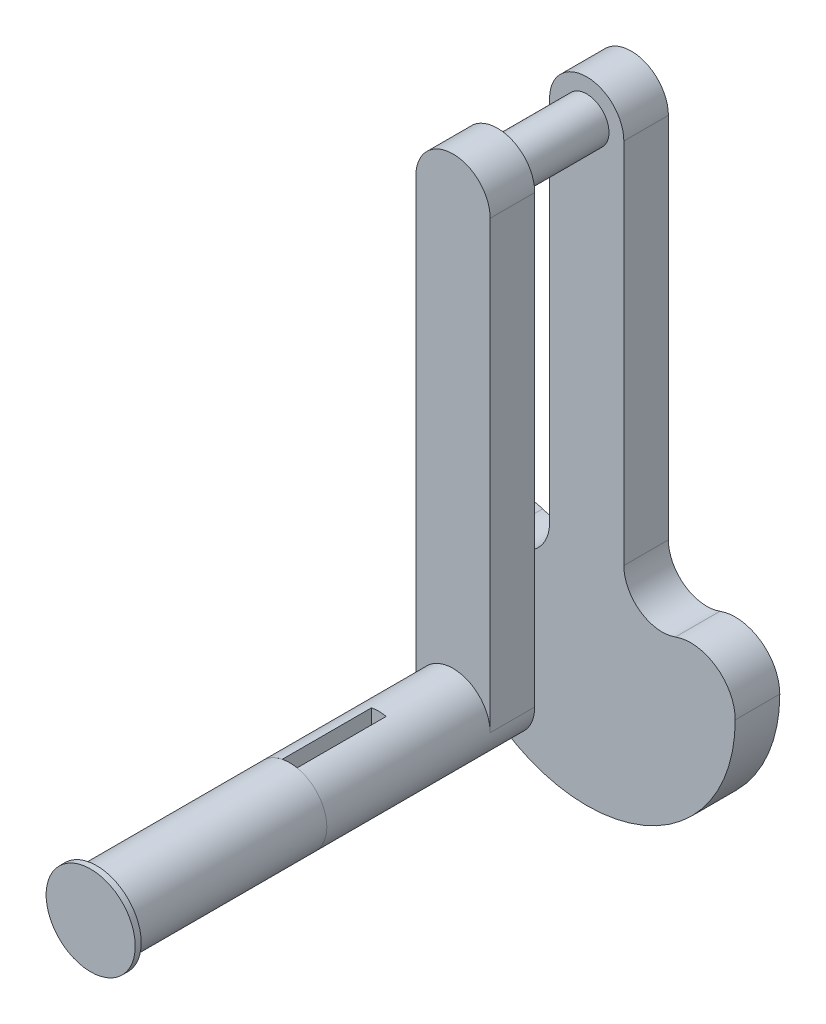
ISO-10303-21;
HEADER;
FILE_DESCRIPTION(('STEP AP214'),'2;1');
FILE_NAME('part.step','',(''),(''),'','','');
FILE_SCHEMA(('AUTOMOTIVE_DESIGN { 1 0 10303 214 1 1 1 1 }'));
ENDSEC;
DATA;
#1=APPLICATION_CONTEXT('core data for automotive mechanical design processes');
#2=APPLICATION_PROTOCOL_DEFINITION('international standard','automotive_design',2000,#1);
#3=PRODUCT_CONTEXT('',#1,'mechanical');
#4=PRODUCT('Part','Part','',(#3));
#5=PRODUCT_RELATED_PRODUCT_CATEGORY('part','',(#4));
#6=PRODUCT_DEFINITION_FORMATION('','',#4);
#7=PRODUCT_DEFINITION_CONTEXT('part definition',#1,'design');
#8=PRODUCT_DEFINITION('design','',#6,#7);
#9=PRODUCT_DEFINITION_SHAPE('','',#8);
#10=(LENGTH_UNIT() NAMED_UNIT(*) SI_UNIT(.MILLI.,.METRE.));
#11=(NAMED_UNIT(*) PLANE_ANGLE_UNIT() SI_UNIT($,.RADIAN.));
#12=(NAMED_UNIT(*) SI_UNIT($,.STERADIAN.) SOLID_ANGLE_UNIT());
#13=UNCERTAINTY_MEASURE_WITH_UNIT(LENGTH_MEASURE(1.E-05),#10,'distance_accuracy_value','');
#14=(GEOMETRIC_REPRESENTATION_CONTEXT(3) GLOBAL_UNCERTAINTY_ASSIGNED_CONTEXT((#13)) GLOBAL_UNIT_ASSIGNED_CONTEXT((#10,
#11,#12)) REPRESENTATION_CONTEXT('',''));
#15=CARTESIAN_POINT('',(0.,0.,0.));
#16=DIRECTION('',(0.,0.,1.));
#17=DIRECTION('',(1.,0.,0.));
#18=AXIS2_PLACEMENT_3D('',#15,#16,#17);
#19=CARTESIAN_POINT('',(0.,0.,97.));
#20=DIRECTION('',(0.,0.,-1.));
#21=DIRECTION('',(-1.,0.,0.));
#22=AXIS2_PLACEMENT_3D('',#19,#20,#21);
#23=CYLINDRICAL_SURFACE('',#22,15.);
#24=CARTESIAN_POINT('',(0.,0.,97.));
#25=DIRECTION('',(0.,0.,1.));
#26=DIRECTION('',(1.,0.,0.));
#27=AXIS2_PLACEMENT_3D('',#24,#25,#26);
#28=CIRCLE('',#27,15.);
#29=CARTESIAN_POINT('',(15.,0.,97.));
#30=VERTEX_POINT('',#29);
#31=EDGE_CURVE('E12',#30,#30,#28,.T.);
#32=ORIENTED_EDGE('',*,*,#31,.F.);
#33=EDGE_LOOP('',(#32));
#34=FACE_BOUND('',#33,.T.);
#35=CARTESIAN_POINT('',(0.,0.,95.));
#36=DIRECTION('',(0.,0.,1.));
#37=DIRECTION('',(1.,0.,0.));
#38=AXIS2_PLACEMENT_3D('',#35,#36,#37);
#39=CIRCLE('',#38,15.);
#40=CARTESIAN_POINT('',(15.,0.,95.));
#41=VERTEX_POINT('',#40);
#42=EDGE_CURVE('E58',#41,#41,#39,.T.);
#43=ORIENTED_EDGE('',*,*,#42,.T.);
#44=EDGE_LOOP('',(#43));
#45=FACE_BOUND('',#44,.T.);
#46=ADVANCED_FACE('F55',(#34,#45),#23,.T.);
#47=CARTESIAN_POINT('',(0.,0.,97.));
#48=DIRECTION('',(0.,0.,1.));
#49=DIRECTION('',(1.,0.,0.));
#50=AXIS2_PLACEMENT_3D('',#47,#48,#49);
#51=PLANE('',#50);
#52=ORIENTED_EDGE('',*,*,#31,.T.);
#53=EDGE_LOOP('',(#52));
#54=FACE_BOUND('',#53,.T.);
#55=ADVANCED_FACE('F70',(#54),#51,.T.);
#56=CARTESIAN_POINT('',(0.,0.,95.));
#57=DIRECTION('',(0.,0.,1.));
#58=DIRECTION('',(1.,0.,0.));
#59=AXIS2_PLACEMENT_3D('',#56,#57,#58);
#60=PLANE('',#59);
#61=ORIENTED_EDGE('',*,*,#42,.F.);
#62=EDGE_LOOP('',(#61));
#63=FACE_BOUND('',#62,.T.);
#64=ADVANCED_FACE('F68',(#63),#60,.F.);
#65=CLOSED_SHELL('',(#46,#55,#64));
#66=MANIFOLD_SOLID_BREP('B2',#65);
#67=CARTESIAN_POINT('',(0.,0.,95.));
#68=DIRECTION('',(0.,0.,-1.));
#69=DIRECTION('',(-1.,0.,0.));
#70=AXIS2_PLACEMENT_3D('',#67,#68,#69);
#71=CYLINDRICAL_SURFACE('',#70,12.5);
#72=CARTESIAN_POINT('',(0.,0.,95.));
#73=DIRECTION('',(0.,0.,1.));
#74=DIRECTION('',(1.,0.,0.));
#75=AXIS2_PLACEMENT_3D('',#72,#73,#74);
#76=CIRCLE('',#75,12.5);
#77=CARTESIAN_POINT('',(12.5,0.,95.));
#78=VERTEX_POINT('',#77);
#79=EDGE_CURVE('E54',#78,#78,#76,.T.);
#80=ORIENTED_EDGE('',*,*,#79,.F.);
#81=EDGE_LOOP('',(#80));
#82=FACE_BOUND('',#81,.T.);
#83=CARTESIAN_POINT('',(0.,0.,30.));
#84=DIRECTION('',(0.,0.,1.));
#85=DIRECTION('',(1.,0.,0.));
#86=AXIS2_PLACEMENT_3D('',#83,#84,#85);
#87=CIRCLE('',#86,12.5);
#88=CARTESIAN_POINT('',(12.5,0.,30.));
#89=VERTEX_POINT('',#88);
#90=EDGE_CURVE('E107',#89,#89,#87,.T.);
#91=ORIENTED_EDGE('',*,*,#90,.T.);
#92=EDGE_LOOP('',(#91));
#93=FACE_BOUND('',#92,.T.);
#94=ADVANCED_FACE('F104',(#82,#93),#71,.T.);
#95=CARTESIAN_POINT('',(0.,0.,95.));
#96=DIRECTION('',(0.,0.,1.));
#97=DIRECTION('',(1.,0.,0.));
#98=AXIS2_PLACEMENT_3D('',#95,#96,#97);
#99=PLANE('',#98);
#100=ORIENTED_EDGE('',*,*,#79,.T.);
#101=EDGE_LOOP('',(#100));
#102=FACE_BOUND('',#101,.T.);
#103=ADVANCED_FACE('F119',(#102),#99,.T.);
#104=CARTESIAN_POINT('',(0.,0.,30.));
#105=DIRECTION('',(0.,0.,1.));
#106=DIRECTION('',(1.,0.,0.));
#107=AXIS2_PLACEMENT_3D('',#104,#105,#106);
#108=PLANE('',#107);
#109=ORIENTED_EDGE('',*,*,#90,.F.);
#110=EDGE_LOOP('',(#109));
#111=FACE_BOUND('',#110,.T.);
#112=ADVANCED_FACE('F117',(#111),#108,.F.);
#113=CLOSED_SHELL('',(#94,#103,#112));
#114=MANIFOLD_SOLID_BREP('B7',#113);
#115=CARTESIAN_POINT('',(-2.5,0.,-25.));
#116=DIRECTION('',(-1.,0.,0.));
#117=DIRECTION('',(0.,-1.,0.));
#118=AXIS2_PLACEMENT_3D('',#115,#116,#117);
#119=PLANE('',#118);
#120=DIRECTION('',(0.,0.,1.));
#121=VECTOR('',#120,1.);
#122=CARTESIAN_POINT('',(-2.5,7.24744871391589,-25.));
#123=LINE('',#122,#121);
#124=CARTESIAN_POINT('',(-2.5,7.24744871391589,0.));
#125=VERTEX_POINT('',#124);
#126=CARTESIAN_POINT('',(-2.5,7.24744871391589,30.));
#127=VERTEX_POINT('',#126);
#128=EDGE_CURVE('E151',#125,#127,#123,.T.);
#129=ORIENTED_EDGE('',*,*,#128,.F.);
#130=DIRECTION('',(0.,1.,0.));
#131=VECTOR('',#130,1.);
#132=CARTESIAN_POINT('',(-2.5,0.,0.));
#133=LINE('',#132,#131);
#134=CARTESIAN_POINT('',(-2.5,12.2474487139159,0.));
#135=VERTEX_POINT('',#134);
#136=EDGE_CURVE('E380',#125,#135,#133,.T.);
#137=ORIENTED_EDGE('',*,*,#136,.T.);
#138=DIRECTION('',(0.,0.,1.));
#139=VECTOR('',#138,1.);
#140=CARTESIAN_POINT('',(-2.5,12.2474487139159,-25.));
#141=LINE('',#140,#139);
#142=CARTESIAN_POINT('',(-2.5,12.2474487139159,30.));
#143=VERTEX_POINT('',#142);
#144=EDGE_CURVE('E274',#135,#143,#141,.T.);
#145=ORIENTED_EDGE('',*,*,#144,.T.);
#146=DIRECTION('',(0.,-1.,0.));
#147=VECTOR('',#146,1.);
#148=CARTESIAN_POINT('',(-2.5,0.,30.));
#149=LINE('',#148,#147);
#150=EDGE_CURVE('E292',#143,#127,#149,.T.);
#151=ORIENTED_EDGE('',*,*,#150,.T.);
#152=EDGE_LOOP('',(#129,#137,#145,#151));
#153=FACE_BOUND('',#152,.T.);
#154=ADVANCED_FACE('F144',(#153),#119,.F.);
#155=CARTESIAN_POINT('',(0.,7.24744871391589,-25.));
#156=DIRECTION('',(0.,-1.,0.));
#157=DIRECTION('',(0.,0.,-1.));
#158=AXIS2_PLACEMENT_3D('',#155,#156,#157);
#159=PLANE('',#158);
#160=DIRECTION('',(0.,0.,1.));
#161=VECTOR('',#160,1.);
#162=CARTESIAN_POINT('',(2.5,7.24744871391589,-25.));
#163=LINE('',#162,#161);
#164=CARTESIAN_POINT('',(2.5,7.24744871391589,0.));
#165=VERTEX_POINT('',#164);
#166=CARTESIAN_POINT('',(2.5,7.24744871391589,30.));
#167=VERTEX_POINT('',#166);
#168=EDGE_CURVE('E281',#165,#167,#163,.T.);
#169=ORIENTED_EDGE('',*,*,#168,.F.);
#170=DIRECTION('',(-1.,0.,0.));
#171=VECTOR('',#170,1.);
#172=CARTESIAN_POINT('',(0.,7.24744871391589,0.));
#173=LINE('',#172,#171);
#174=EDGE_CURVE('E262',#165,#125,#173,.T.);
#175=ORIENTED_EDGE('',*,*,#174,.T.);
#176=ORIENTED_EDGE('',*,*,#128,.T.);
#177=DIRECTION('',(1.,0.,0.));
#178=VECTOR('',#177,1.);
#179=CARTESIAN_POINT('',(0.,7.24744871391589,30.));
#180=LINE('',#179,#178);
#181=EDGE_CURVE('E287',#127,#167,#180,.T.);
#182=ORIENTED_EDGE('',*,*,#181,.T.);
#183=EDGE_LOOP('',(#169,#175,#176,#182));
#184=FACE_BOUND('',#183,.T.);
#185=ADVANCED_FACE('F419',(#184),#159,.F.);
#186=CARTESIAN_POINT('',(2.5,0.,-25.));
#187=DIRECTION('',(1.,0.,0.));
#188=DIRECTION('',(0.,1.,0.));
#189=AXIS2_PLACEMENT_3D('',#186,#187,#188);
#190=PLANE('',#189);
#191=DIRECTION('',(0.,0.,1.));
#192=VECTOR('',#191,1.);
#193=CARTESIAN_POINT('',(2.5,12.2474487139159,-25.));
#194=LINE('',#193,#192);
#195=CARTESIAN_POINT('',(2.5,12.2474487139159,0.));
#196=VERTEX_POINT('',#195);
#197=CARTESIAN_POINT('',(2.5,12.2474487139159,30.));
#198=VERTEX_POINT('',#197);
#199=EDGE_CURVE('E272',#196,#198,#194,.T.);
#200=ORIENTED_EDGE('',*,*,#199,.F.);
#201=DIRECTION('',(0.,-1.,0.));
#202=VECTOR('',#201,1.);
#203=CARTESIAN_POINT('',(2.5,0.,0.));
#204=LINE('',#203,#202);
#205=EDGE_CURVE('E257',#196,#165,#204,.T.);
#206=ORIENTED_EDGE('',*,*,#205,.T.);
#207=ORIENTED_EDGE('',*,*,#168,.T.);
#208=DIRECTION('',(0.,1.,0.));
#209=VECTOR('',#208,1.);
#210=CARTESIAN_POINT('',(2.5,0.,30.));
#211=LINE('',#210,#209);
#212=EDGE_CURVE('E279',#167,#198,#211,.T.);
#213=ORIENTED_EDGE('',*,*,#212,.T.);
#214=EDGE_LOOP('',(#200,#206,#207,#213));
#215=FACE_BOUND('',#214,.T.);
#216=ADVANCED_FACE('F277',(#215),#190,.F.);
#217=CARTESIAN_POINT('',(0.,0.,-25.));
#218=DIRECTION('',(0.,0.,1.));
#219=DIRECTION('',(1.,0.,0.));
#220=AXIS2_PLACEMENT_3D('',#217,#218,#219);
#221=CYLINDRICAL_SURFACE('',#220,12.5);
#222=ORIENTED_EDGE('',*,*,#144,.F.);
#223=CARTESIAN_POINT('',(0.,0.,0.));
#224=DIRECTION('',(0.,0.,1.));
#225=DIRECTION('',(1.,0.,0.));
#226=AXIS2_PLACEMENT_3D('',#223,#224,#225);
#227=CIRCLE('',#226,12.5);
#228=EDGE_CURVE('E260',#196,#135,#227,.T.);
#229=ORIENTED_EDGE('',*,*,#228,.F.);
#230=ORIENTED_EDGE('',*,*,#199,.T.);
#231=CARTESIAN_POINT('',(0.,0.,30.));
#232=DIRECTION('',(0.,0.,1.));
#233=DIRECTION('',(1.,0.,0.));
#234=AXIS2_PLACEMENT_3D('',#231,#232,#233);
#235=CIRCLE('',#234,12.5);
#236=EDGE_CURVE('E290',#143,#198,#235,.T.);
#237=ORIENTED_EDGE('',*,*,#236,.F.);
#238=EDGE_LOOP('',(#222,#229,#230,#237));
#239=FACE_BOUND('',#238,.T.);
#240=DIRECTION('',(0.,0.,1.));
#241=VECTOR('',#240,1.);
#242=CARTESIAN_POINT('',(12.5,0.,-40.));
#243=LINE('',#242,#241);
#244=CARTESIAN_POINT('',(12.5,0.,-40.));
#245=VERTEX_POINT('',#244);
#246=CARTESIAN_POINT('',(12.5,0.,-25.));
#247=VERTEX_POINT('',#246);
#248=EDGE_CURVE('E305',#245,#247,#243,.T.);
#249=ORIENTED_EDGE('',*,*,#248,.T.);
#250=CARTESIAN_POINT('',(0.,0.,-25.));
#251=DIRECTION('',(0.,0.,1.));
#252=DIRECTION('',(1.,0.,0.));
#253=AXIS2_PLACEMENT_3D('',#250,#251,#252);
#254=CIRCLE('',#253,12.5);
#255=CARTESIAN_POINT('',(-12.5,0.,-25.));
#256=VERTEX_POINT('',#255);
#257=EDGE_CURVE('E284',#247,#256,#254,.T.);
#258=ORIENTED_EDGE('',*,*,#257,.T.);
#259=DIRECTION('',(0.,0.,1.));
#260=VECTOR('',#259,1.);
#261=CARTESIAN_POINT('',(-12.5,0.,-40.));
#262=LINE('',#261,#260);
#263=CARTESIAN_POINT('',(-12.5,0.,-40.));
#264=VERTEX_POINT('',#263);
#265=EDGE_CURVE('E295',#264,#256,#262,.T.);
#266=ORIENTED_EDGE('',*,*,#265,.F.);
#267=CARTESIAN_POINT('',(0.,0.,-40.));
#268=DIRECTION('',(0.,0.,-1.));
#269=DIRECTION('',(-1.,0.,0.));
#270=AXIS2_PLACEMENT_3D('',#267,#268,#269);
#271=CIRCLE('',#270,12.5);
#272=EDGE_CURVE('E311',#245,#264,#271,.T.);
#273=ORIENTED_EDGE('',*,*,#272,.F.);
#274=EDGE_LOOP('',(#249,#258,#266,#273));
#275=FACE_BOUND('',#274,.T.);
#276=ADVANCED_FACE('F269',(#239,#275),#221,.T.);
#277=CARTESIAN_POINT('',(0.,0.,30.));
#278=DIRECTION('',(0.,0.,1.));
#279=DIRECTION('',(1.,0.,0.));
#280=AXIS2_PLACEMENT_3D('',#277,#278,#279);
#281=PLANE('',#280);
#282=ORIENTED_EDGE('',*,*,#150,.F.);
#283=ORIENTED_EDGE('',*,*,#236,.T.);
#284=ORIENTED_EDGE('',*,*,#212,.F.);
#285=ORIENTED_EDGE('',*,*,#181,.F.);
#286=EDGE_LOOP('',(#282,#283,#284,#285));
#287=FACE_BOUND('',#286,.T.);
#288=ADVANCED_FACE('F427',(#287),#281,.T.);
#289=CARTESIAN_POINT('',(-12.5,0.,-40.));
#290=DIRECTION('',(1.,0.,0.));
#291=DIRECTION('',(0.,0.,-1.));
#292=AXIS2_PLACEMENT_3D('',#289,#290,#291);
#293=PLANE('',#292);
#294=DIRECTION('',(0.,1.,0.));
#295=VECTOR('',#294,1.);
#296=CARTESIAN_POINT('',(-12.5,0.,-25.));
#297=LINE('',#296,#295);
#298=CARTESIAN_POINT('',(-12.5,150.,-25.));
#299=VERTEX_POINT('',#298);
#300=EDGE_CURVE('E314',#256,#299,#297,.T.);
#301=ORIENTED_EDGE('',*,*,#300,.T.);
#302=DIRECTION('',(0.,0.,1.));
#303=VECTOR('',#302,1.);
#304=CARTESIAN_POINT('',(-12.5,150.,-40.));
#305=LINE('',#304,#303);
#306=CARTESIAN_POINT('',(-12.5,150.,-40.));
#307=VERTEX_POINT('',#306);
#308=EDGE_CURVE('E299',#307,#299,#305,.T.);
#309=ORIENTED_EDGE('',*,*,#308,.F.);
#310=DIRECTION('',(0.,1.,0.));
#311=VECTOR('',#310,1.);
#312=CARTESIAN_POINT('',(-12.5,0.,-40.));
#313=LINE('',#312,#311);
#314=EDGE_CURVE('E320',#264,#307,#313,.T.);
#315=ORIENTED_EDGE('',*,*,#314,.F.);
#316=ORIENTED_EDGE('',*,*,#265,.T.);
#317=EDGE_LOOP('',(#301,#309,#315,#316));
#318=FACE_BOUND('',#317,.T.);
#319=ADVANCED_FACE('F429',(#318),#293,.F.);
#320=CARTESIAN_POINT('',(0.,150.,-40.));
#321=DIRECTION('',(0.,0.,1.));
#322=DIRECTION('',(1.,0.,0.));
#323=AXIS2_PLACEMENT_3D('',#320,#321,#322);
#324=CYLINDRICAL_SURFACE('',#323,12.5);
#325=CARTESIAN_POINT('',(0.,150.,-25.));
#326=DIRECTION('',(0.,0.,-1.));
#327=DIRECTION('',(1.,0.,0.));
#328=AXIS2_PLACEMENT_3D('',#325,#326,#327);
#329=CIRCLE('',#328,12.5);
#330=CARTESIAN_POINT('',(12.5,150.,-25.));
#331=VERTEX_POINT('',#330);
#332=EDGE_CURVE('E312',#299,#331,#329,.T.);
#333=ORIENTED_EDGE('',*,*,#332,.T.);
#334=DIRECTION('',(0.,0.,1.));
#335=VECTOR('',#334,1.);
#336=CARTESIAN_POINT('',(12.5,150.,-40.));
#337=LINE('',#336,#335);
#338=CARTESIAN_POINT('',(12.5,150.,-40.));
#339=VERTEX_POINT('',#338);
#340=EDGE_CURVE('E302',#339,#331,#337,.T.);
#341=ORIENTED_EDGE('',*,*,#340,.F.);
#342=CARTESIAN_POINT('',(0.,150.,-40.));
#343=DIRECTION('',(0.,0.,-1.));
#344=DIRECTION('',(1.,0.,0.));
#345=AXIS2_PLACEMENT_3D('',#342,#343,#344);
#346=CIRCLE('',#345,12.5);
#347=EDGE_CURVE('E318',#307,#339,#346,.T.);
#348=ORIENTED_EDGE('',*,*,#347,.F.);
#349=ORIENTED_EDGE('',*,*,#308,.T.);
#350=EDGE_LOOP('',(#333,#341,#348,#349));
#351=FACE_BOUND('',#350,.T.);
#352=ADVANCED_FACE('F435',(#351),#324,.T.);
#353=CARTESIAN_POINT('',(12.5,0.,-40.));
#354=DIRECTION('',(-1.,0.,0.));
#355=DIRECTION('',(0.,0.,1.));
#356=AXIS2_PLACEMENT_3D('',#353,#354,#355);
#357=PLANE('',#356);
#358=DIRECTION('',(0.,-1.,0.));
#359=VECTOR('',#358,1.);
#360=CARTESIAN_POINT('',(12.5,0.,-25.));
#361=LINE('',#360,#359);
#362=EDGE_CURVE('E308',#331,#247,#361,.T.);
#363=ORIENTED_EDGE('',*,*,#362,.T.);
#364=ORIENTED_EDGE('',*,*,#248,.F.);
#365=DIRECTION('',(0.,-1.,0.));
#366=VECTOR('',#365,1.);
#367=CARTESIAN_POINT('',(12.5,0.,-40.));
#368=LINE('',#367,#366);
#369=EDGE_CURVE('E307',#339,#245,#368,.T.);
#370=ORIENTED_EDGE('',*,*,#369,.F.);
#371=ORIENTED_EDGE('',*,*,#340,.T.);
#372=EDGE_LOOP('',(#363,#364,#370,#371));
#373=FACE_BOUND('',#372,.T.);
#374=ADVANCED_FACE('F465',(#373),#357,.F.);
#375=CARTESIAN_POINT('',(0.,0.,-40.));
#376=DIRECTION('',(0.,0.,-1.));
#377=DIRECTION('',(-1.,0.,0.));
#378=AXIS2_PLACEMENT_3D('',#375,#376,#377);
#379=PLANE('',#378);
#380=CARTESIAN_POINT('',(0.,150.,-40.));
#381=DIRECTION('',(0.,0.,-1.));
#382=DIRECTION('',(-1.,0.,0.));
#383=AXIS2_PLACEMENT_3D('',#380,#381,#382);
#384=CIRCLE('',#383,7.5);
#385=CARTESIAN_POINT('',(-7.5,150.,-40.));
#386=VERTEX_POINT('',#385);
#387=EDGE_CURVE('E324',#386,#386,#384,.T.);
#388=ORIENTED_EDGE('',*,*,#387,.F.);
#389=EDGE_LOOP('',(#388));
#390=FACE_BOUND('',#389,.T.);
#391=ORIENTED_EDGE('',*,*,#272,.T.);
#392=ORIENTED_EDGE('',*,*,#314,.T.);
#393=ORIENTED_EDGE('',*,*,#347,.T.);
#394=ORIENTED_EDGE('',*,*,#369,.T.);
#395=EDGE_LOOP('',(#391,#392,#393,#394));
#396=FACE_BOUND('',#395,.T.);
#397=ADVANCED_FACE('F470',(#390,#396),#379,.T.);
#398=CARTESIAN_POINT('',(0.,0.,-25.));
#399=DIRECTION('',(0.,0.,-1.));
#400=DIRECTION('',(-1.,0.,0.));
#401=AXIS2_PLACEMENT_3D('',#398,#399,#400);
#402=PLANE('',#401);
#403=ORIENTED_EDGE('',*,*,#257,.F.);
#404=ORIENTED_EDGE('',*,*,#362,.F.);
#405=ORIENTED_EDGE('',*,*,#332,.F.);
#406=ORIENTED_EDGE('',*,*,#300,.F.);
#407=EDGE_LOOP('',(#403,#404,#405,#406));
#408=FACE_BOUND('',#407,.T.);
#409=ADVANCED_FACE('F478',(#408),#402,.F.);
#410=CARTESIAN_POINT('',(0.,150.,-70.));
#411=DIRECTION('',(0.,0.,1.));
#412=DIRECTION('',(1.,0.,0.));
#413=AXIS2_PLACEMENT_3D('',#410,#411,#412);
#414=CYLINDRICAL_SURFACE('',#413,7.5);
#415=CARTESIAN_POINT('',(0.,150.,-70.));
#416=DIRECTION('',(0.,0.,-1.));
#417=DIRECTION('',(-1.,0.,0.));
#418=AXIS2_PLACEMENT_3D('',#415,#416,#417);
#419=CIRCLE('',#418,7.5);
#420=CARTESIAN_POINT('',(-7.5,150.,-70.));
#421=VERTEX_POINT('',#420);
#422=EDGE_CURVE('E316',#421,#421,#419,.T.);
#423=ORIENTED_EDGE('',*,*,#422,.F.);
#424=EDGE_LOOP('',(#423));
#425=FACE_BOUND('',#424,.T.);
#426=ORIENTED_EDGE('',*,*,#387,.T.);
#427=EDGE_LOOP('',(#426));
#428=FACE_BOUND('',#427,.T.);
#429=ADVANCED_FACE('F483',(#425,#428),#414,.T.);
#430=CARTESIAN_POINT('',(0.,150.,-85.));
#431=DIRECTION('',(0.,0.,1.));
#432=DIRECTION('',(1.,0.,0.));
#433=AXIS2_PLACEMENT_3D('',#430,#431,#432);
#434=CYLINDRICAL_SURFACE('',#433,12.5);
#435=CARTESIAN_POINT('',(0.,150.,-70.));
#436=DIRECTION('',(0.,0.,-1.));
#437=DIRECTION('',(1.,0.,0.));
#438=AXIS2_PLACEMENT_3D('',#435,#436,#437);
#439=CIRCLE('',#438,12.5);
#440=CARTESIAN_POINT('',(-12.5,150.,-70.));
#441=VERTEX_POINT('',#440);
#442=CARTESIAN_POINT('',(12.5,150.,-70.));
#443=VERTEX_POINT('',#442);
#444=EDGE_CURVE('E342',#441,#443,#439,.T.);
#445=ORIENTED_EDGE('',*,*,#444,.T.);
#446=DIRECTION('',(0.,0.,1.));
#447=VECTOR('',#446,1.);
#448=CARTESIAN_POINT('',(12.5,150.,-85.));
#449=LINE('',#448,#447);
#450=CARTESIAN_POINT('',(12.5,150.,-85.));
#451=VERTEX_POINT('',#450);
#452=EDGE_CURVE('E327',#451,#443,#449,.T.);
#453=ORIENTED_EDGE('',*,*,#452,.F.);
#454=CARTESIAN_POINT('',(0.,150.,-85.));
#455=DIRECTION('',(0.,0.,-1.));
#456=DIRECTION('',(1.,0.,0.));
#457=AXIS2_PLACEMENT_3D('',#454,#455,#456);
#458=CIRCLE('',#457,12.5);
#459=CARTESIAN_POINT('',(-12.5,150.,-85.));
#460=VERTEX_POINT('',#459);
#461=EDGE_CURVE('E338',#460,#451,#458,.T.);
#462=ORIENTED_EDGE('',*,*,#461,.F.);
#463=DIRECTION('',(0.,0.,1.));
#464=VECTOR('',#463,1.);
#465=CARTESIAN_POINT('',(-12.5,150.,-85.));
#466=LINE('',#465,#464);
#467=EDGE_CURVE('E332',#460,#441,#466,.T.);
#468=ORIENTED_EDGE('',*,*,#467,.T.);
#469=EDGE_LOOP('',(#445,#453,#462,#468));
#470=FACE_BOUND('',#469,.T.);
#471=ADVANCED_FACE('F570',(#470),#434,.T.);
#472=CARTESIAN_POINT('',(12.5,150.,-85.));
#473=DIRECTION('',(-1.,0.,0.));
#474=DIRECTION('',(0.,0.,1.));
#475=AXIS2_PLACEMENT_3D('',#472,#473,#474);
#476=PLANE('',#475);
#477=DIRECTION('',(0.,-1.,0.));
#478=VECTOR('',#477,1.);
#479=CARTESIAN_POINT('',(12.5,150.,-70.));
#480=LINE('',#479,#478);
#481=CARTESIAN_POINT('',(12.5,26.2396049751373,-70.));
#482=VERTEX_POINT('',#481);
#483=EDGE_CURVE('E339',#443,#482,#480,.T.);
#484=ORIENTED_EDGE('',*,*,#483,.T.);
#485=DIRECTION('',(0.,0.,1.));
#486=VECTOR('',#485,1.);
#487=CARTESIAN_POINT('',(12.5,26.2396049751373,-218.696363043814));
#488=LINE('',#487,#486);
#489=CARTESIAN_POINT('',(12.5,26.2396049751373,-85.));
#490=VERTEX_POINT('',#489);
#491=EDGE_CURVE('E362',#490,#482,#488,.T.);
#492=ORIENTED_EDGE('',*,*,#491,.F.);
#493=DIRECTION('',(0.,-1.,0.));
#494=VECTOR('',#493,1.);
#495=CARTESIAN_POINT('',(12.5,150.,-85.));
#496=LINE('',#495,#494);
#497=EDGE_CURVE('E347',#451,#490,#496,.T.);
#498=ORIENTED_EDGE('',*,*,#497,.F.);
#499=ORIENTED_EDGE('',*,*,#452,.T.);
#500=EDGE_LOOP('',(#484,#492,#498,#499));
#501=FACE_BOUND('',#500,.T.);
#502=ADVANCED_FACE('F566',(#501),#476,.F.);
#503=CARTESIAN_POINT('',(-12.5,150.,-85.));
#504=DIRECTION('',(1.,0.,0.));
#505=DIRECTION('',(0.,1.,0.));
#506=AXIS2_PLACEMENT_3D('',#503,#504,#505);
#507=PLANE('',#506);
#508=DIRECTION('',(0.,1.,0.));
#509=VECTOR('',#508,1.);
#510=CARTESIAN_POINT('',(-12.5,150.,-85.));
#511=LINE('',#510,#509);
#512=CARTESIAN_POINT('',(-12.5,26.2396049751373,-85.));
#513=VERTEX_POINT('',#512);
#514=EDGE_CURVE('E335',#513,#460,#511,.T.);
#515=ORIENTED_EDGE('',*,*,#514,.F.);
#516=DIRECTION('',(0.,0.,1.));
#517=VECTOR('',#516,1.);
#518=CARTESIAN_POINT('',(-12.5,26.2396049751373,-218.696363043814));
#519=LINE('',#518,#517);
#520=CARTESIAN_POINT('',(-12.5,26.2396049751373,-70.));
#521=VERTEX_POINT('',#520);
#522=EDGE_CURVE('E158',#513,#521,#519,.T.);
#523=ORIENTED_EDGE('',*,*,#522,.T.);
#524=DIRECTION('',(0.,1.,0.));
#525=VECTOR('',#524,1.);
#526=CARTESIAN_POINT('',(-12.5,150.,-70.));
#527=LINE('',#526,#525);
#528=EDGE_CURVE('E336',#521,#441,#527,.T.);
#529=ORIENTED_EDGE('',*,*,#528,.T.);
#530=ORIENTED_EDGE('',*,*,#467,.F.);
#531=EDGE_LOOP('',(#515,#523,#529,#530));
#532=FACE_BOUND('',#531,.T.);
#533=ADVANCED_FACE('F510',(#532),#507,.F.);
#534=CARTESIAN_POINT('',(0.,150.,-85.));
#535=DIRECTION('',(0.,0.,1.));
#536=DIRECTION('',(1.,0.,0.));
#537=AXIS2_PLACEMENT_3D('',#534,#535,#536);
#538=PLANE('',#537);
#539=CARTESIAN_POINT('',(-33.8074039201174,-9.05866657858836,-85.));
#540=DIRECTION('',(0.,0.,1.));
#541=DIRECTION('',(1.,0.,0.));
#542=AXIS2_PLACEMENT_3D('',#539,#540,#541);
#543=CIRCLE('',#542,5.);
#544=CARTESIAN_POINT('',(-28.8074039201174,-9.05866657858836,-85.));
#545=VERTEX_POINT('',#544);
#546=EDGE_CURVE('E102',#545,#545,#543,.F.);
#547=ORIENTED_EDGE('',*,*,#546,.F.);
#548=EDGE_LOOP('',(#547));
#549=FACE_BOUND('',#548,.T.);
#550=ORIENTED_EDGE('',*,*,#497,.T.);
#551=CARTESIAN_POINT('',(25.43022492335,26.2396049751373,-85.));
#552=DIRECTION('',(0.,0.,1.));
#553=DIRECTION('',(1.,0.,0.));
#554=AXIS2_PLACEMENT_3D('',#551,#552,#553);
#555=CIRCLE('',#554,12.93022492335);
#556=CARTESIAN_POINT('',(29.8605273840905,14.0920481559749,-85.));
#557=VERTEX_POINT('',#556);
#558=EDGE_CURVE('E352',#557,#490,#555,.F.);
#559=ORIENTED_EDGE('',*,*,#558,.F.);
#560=CARTESIAN_POINT('',(35.,0.,-85.));
#561=DIRECTION('',(0.,0.,1.));
#562=DIRECTION('',(1.,0.,0.));
#563=AXIS2_PLACEMENT_3D('',#560,#561,#562);
#564=CIRCLE('',#563,15.);
#565=CARTESIAN_POINT('',(50.,0.,-85.));
#566=VERTEX_POINT('',#565);
#567=EDGE_CURVE('E345',#566,#557,#564,.T.);
#568=ORIENTED_EDGE('',*,*,#567,.F.);
#569=CARTESIAN_POINT('',(0.,0.,-85.));
#570=DIRECTION('',(0.,0.,1.));
#571=DIRECTION('',(1.,0.,0.));
#572=AXIS2_PLACEMENT_3D('',#569,#570,#571);
#573=CIRCLE('',#572,50.);
#574=CARTESIAN_POINT('',(-50.,0.,-85.));
#575=VERTEX_POINT('',#574);
#576=EDGE_CURVE('E383',#575,#566,#573,.T.);
#577=ORIENTED_EDGE('',*,*,#576,.F.);
#578=CARTESIAN_POINT('',(-35.,0.,-85.));
#579=DIRECTION('',(0.,0.,1.));
#580=DIRECTION('',(1.,0.,0.));
#581=AXIS2_PLACEMENT_3D('',#578,#579,#580);
#582=CIRCLE('',#581,15.);
#583=CARTESIAN_POINT('',(-29.8605273840905,14.0920481559749,-85.));
#584=VERTEX_POINT('',#583);
#585=EDGE_CURVE('E386',#584,#575,#582,.T.);
#586=ORIENTED_EDGE('',*,*,#585,.F.);
#587=CARTESIAN_POINT('',(-25.43022492335,26.2396049751373,-85.));
#588=DIRECTION('',(0.,0.,1.));
#589=DIRECTION('',(1.,0.,0.));
#590=AXIS2_PLACEMENT_3D('',#587,#588,#589);
#591=CIRCLE('',#590,12.93022492335);
#592=EDGE_CURVE('E354',#513,#584,#591,.F.);
#593=ORIENTED_EDGE('',*,*,#592,.F.);
#594=ORIENTED_EDGE('',*,*,#514,.T.);
#595=ORIENTED_EDGE('',*,*,#461,.T.);
#596=EDGE_LOOP('',(#550,#559,#568,#577,#586,#593,#594,#595));
#597=FACE_BOUND('',#596,.T.);
#598=ADVANCED_FACE('F504',(#549,#597),#538,.F.);
#599=CARTESIAN_POINT('',(0.,150.,-70.));
#600=DIRECTION('',(0.,0.,1.));
#601=DIRECTION('',(1.,0.,0.));
#602=AXIS2_PLACEMENT_3D('',#599,#600,#601);
#603=PLANE('',#602);
#604=CARTESIAN_POINT('',(25.43022492335,26.2396049751373,-70.));
#605=DIRECTION('',(0.,0.,1.));
#606=DIRECTION('',(-1.,0.,0.));
#607=AXIS2_PLACEMENT_3D('',#604,#605,#606);
#608=CIRCLE('',#607,12.93022492335);
#609=CARTESIAN_POINT('',(29.8605273840905,14.0920481559749,-70.));
#610=VERTEX_POINT('',#609);
#611=EDGE_CURVE('E366',#482,#610,#608,.T.);
#612=ORIENTED_EDGE('',*,*,#611,.F.);
#613=ORIENTED_EDGE('',*,*,#483,.F.);
#614=ORIENTED_EDGE('',*,*,#444,.F.);
#615=ORIENTED_EDGE('',*,*,#528,.F.);
#616=CARTESIAN_POINT('',(-25.43022492335,26.2396049751373,-70.));
#617=DIRECTION('',(0.,0.,1.));
#618=DIRECTION('',(-1.,0.,0.));
#619=AXIS2_PLACEMENT_3D('',#616,#617,#618);
#620=CIRCLE('',#619,12.93022492335);
#621=CARTESIAN_POINT('',(-29.8605273840905,14.0920481559749,-70.));
#622=VERTEX_POINT('',#621);
#623=EDGE_CURVE('E369',#622,#521,#620,.T.);
#624=ORIENTED_EDGE('',*,*,#623,.F.);
#625=CARTESIAN_POINT('',(-35.,0.,-70.));
#626=DIRECTION('',(0.,0.,-1.));
#627=DIRECTION('',(1.,0.,0.));
#628=AXIS2_PLACEMENT_3D('',#625,#626,#627);
#629=CIRCLE('',#628,15.);
#630=CARTESIAN_POINT('',(-50.,0.,-70.));
#631=VERTEX_POINT('',#630);
#632=EDGE_CURVE('E371',#631,#622,#629,.T.);
#633=ORIENTED_EDGE('',*,*,#632,.F.);
#634=CARTESIAN_POINT('',(0.,0.,-70.));
#635=DIRECTION('',(0.,0.,-1.));
#636=DIRECTION('',(1.,0.,0.));
#637=AXIS2_PLACEMENT_3D('',#634,#635,#636);
#638=CIRCLE('',#637,50.);
#639=CARTESIAN_POINT('',(50.,0.,-70.));
#640=VERTEX_POINT('',#639);
#641=EDGE_CURVE('E374',#640,#631,#638,.T.);
#642=ORIENTED_EDGE('',*,*,#641,.F.);
#643=CARTESIAN_POINT('',(35.,0.,-70.));
#644=DIRECTION('',(0.,0.,-1.));
#645=DIRECTION('',(1.,0.,0.));
#646=AXIS2_PLACEMENT_3D('',#643,#644,#645);
#647=CIRCLE('',#646,15.);
#648=EDGE_CURVE('E377',#610,#640,#647,.T.);
#649=ORIENTED_EDGE('',*,*,#648,.F.);
#650=EDGE_LOOP('',(#612,#613,#614,#615,#624,#633,#642,#649));
#651=FACE_BOUND('',#650,.T.);
#652=ORIENTED_EDGE('',*,*,#422,.T.);
#653=EDGE_LOOP('',(#652));
#654=FACE_BOUND('',#653,.T.);
#655=ADVANCED_FACE('F509',(#651,#654),#603,.T.);
#656=CARTESIAN_POINT('',(25.43022492335,26.2396049751373,-218.696363043814));
#657=DIRECTION('',(0.,0.,1.));
#658=DIRECTION('',(1.,0.,0.));
#659=AXIS2_PLACEMENT_3D('',#656,#657,#658);
#660=CYLINDRICAL_SURFACE('',#659,12.93022492335);
#661=DIRECTION('',(0.,0.,1.));
#662=VECTOR('',#661,1.);
#663=CARTESIAN_POINT('',(29.8605273840905,14.0920481559749,-218.696363043814));
#664=LINE('',#663,#662);
#665=EDGE_CURVE('E364',#557,#610,#664,.T.);
#666=ORIENTED_EDGE('',*,*,#665,.F.);
#667=ORIENTED_EDGE('',*,*,#558,.T.);
#668=ORIENTED_EDGE('',*,*,#491,.T.);
#669=ORIENTED_EDGE('',*,*,#611,.T.);
#670=EDGE_LOOP('',(#666,#667,#668,#669));
#671=FACE_BOUND('',#670,.T.);
#672=ADVANCED_FACE('F546',(#671),#660,.F.);
#673=CARTESIAN_POINT('',(-25.43022492335,26.2396049751373,-218.696363043814));
#674=DIRECTION('',(0.,0.,1.));
#675=DIRECTION('',(1.,0.,0.));
#676=AXIS2_PLACEMENT_3D('',#673,#674,#675);
#677=CYLINDRICAL_SURFACE('',#676,12.93022492335);
#678=ORIENTED_EDGE('',*,*,#522,.F.);
#679=ORIENTED_EDGE('',*,*,#592,.T.);
#680=DIRECTION('',(0.,0.,1.));
#681=VECTOR('',#680,1.);
#682=CARTESIAN_POINT('',(-29.8605273840905,14.0920481559749,-218.696363043814));
#683=LINE('',#682,#681);
#684=EDGE_CURVE('E359',#584,#622,#683,.T.);
#685=ORIENTED_EDGE('',*,*,#684,.T.);
#686=ORIENTED_EDGE('',*,*,#623,.T.);
#687=EDGE_LOOP('',(#678,#679,#685,#686));
#688=FACE_BOUND('',#687,.T.);
#689=ADVANCED_FACE('F549',(#688),#677,.F.);
#690=CARTESIAN_POINT('',(-35.,0.,-218.696363043814));
#691=DIRECTION('',(0.,0.,1.));
#692=DIRECTION('',(1.,0.,0.));
#693=AXIS2_PLACEMENT_3D('',#690,#691,#692);
#694=CYLINDRICAL_SURFACE('',#693,15.);
#695=ORIENTED_EDGE('',*,*,#684,.F.);
#696=ORIENTED_EDGE('',*,*,#585,.T.);
#697=DIRECTION('',(0.,0.,1.));
#698=VECTOR('',#697,1.);
#699=CARTESIAN_POINT('',(-50.,0.,-218.696363043814));
#700=LINE('',#699,#698);
#701=EDGE_CURVE('E357',#575,#631,#700,.T.);
#702=ORIENTED_EDGE('',*,*,#701,.T.);
#703=ORIENTED_EDGE('',*,*,#632,.T.);
#704=EDGE_LOOP('',(#695,#696,#702,#703));
#705=FACE_BOUND('',#704,.T.);
#706=ADVANCED_FACE('F553',(#705),#694,.T.);
#707=CARTESIAN_POINT('',(0.,0.,-218.696363043814));
#708=DIRECTION('',(0.,0.,1.));
#709=DIRECTION('',(1.,0.,0.));
#710=AXIS2_PLACEMENT_3D('',#707,#708,#709);
#711=CYLINDRICAL_SURFACE('',#710,50.);
#712=ORIENTED_EDGE('',*,*,#701,.F.);
#713=ORIENTED_EDGE('',*,*,#576,.T.);
#714=DIRECTION('',(0.,0.,1.));
#715=VECTOR('',#714,1.);
#716=CARTESIAN_POINT('',(50.,0.,-218.696363043814));
#717=LINE('',#716,#715);
#718=EDGE_CURVE('E355',#566,#640,#717,.T.);
#719=ORIENTED_EDGE('',*,*,#718,.T.);
#720=ORIENTED_EDGE('',*,*,#641,.T.);
#721=EDGE_LOOP('',(#712,#713,#719,#720));
#722=FACE_BOUND('',#721,.T.);
#723=ADVANCED_FACE('F556',(#722),#711,.T.);
#724=CARTESIAN_POINT('',(35.,0.,-218.696363043814));
#725=DIRECTION('',(0.,0.,1.));
#726=DIRECTION('',(1.,0.,0.));
#727=AXIS2_PLACEMENT_3D('',#724,#725,#726);
#728=CYLINDRICAL_SURFACE('',#727,15.);
#729=ORIENTED_EDGE('',*,*,#718,.F.);
#730=ORIENTED_EDGE('',*,*,#567,.T.);
#731=ORIENTED_EDGE('',*,*,#665,.T.);
#732=ORIENTED_EDGE('',*,*,#648,.T.);
#733=EDGE_LOOP('',(#729,#730,#731,#732));
#734=FACE_BOUND('',#733,.T.);
#735=ADVANCED_FACE('F495',(#734),#728,.T.);
#736=CARTESIAN_POINT('',(0.,0.,0.));
#737=DIRECTION('',(0.,0.,1.));
#738=DIRECTION('',(1.,0.,0.));
#739=AXIS2_PLACEMENT_3D('',#736,#737,#738);
#740=PLANE('',#739);
#741=ORIENTED_EDGE('',*,*,#136,.F.);
#742=ORIENTED_EDGE('',*,*,#174,.F.);
#743=ORIENTED_EDGE('',*,*,#205,.F.);
#744=ORIENTED_EDGE('',*,*,#228,.T.);
#745=EDGE_LOOP('',(#741,#742,#743,#744));
#746=FACE_BOUND('',#745,.T.);
#747=ADVANCED_FACE('F259',(#746),#740,.T.);
#748=CARTESIAN_POINT('',(-33.8074039201174,-9.05866657858836,-100.));
#749=DIRECTION('',(0.,0.,1.));
#750=DIRECTION('',(1.,0.,0.));
#751=AXIS2_PLACEMENT_3D('',#748,#749,#750);
#752=CYLINDRICAL_SURFACE('',#751,5.);
#753=CARTESIAN_POINT('',(-33.8074039201174,-9.05866657858836,-100.));
#754=DIRECTION('',(0.,0.,-1.));
#755=DIRECTION('',(-1.,0.,0.));
#756=AXIS2_PLACEMENT_3D('',#753,#754,#755);
#757=CIRCLE('',#756,5.);
#758=CARTESIAN_POINT('',(-38.8074039201174,-9.05866657858836,-100.));
#759=VERTEX_POINT('',#758);
#760=EDGE_CURVE('E275',#759,#759,#757,.T.);
#761=ORIENTED_EDGE('',*,*,#760,.F.);
#762=EDGE_LOOP('',(#761));
#763=FACE_BOUND('',#762,.T.);
#764=ORIENTED_EDGE('',*,*,#546,.T.);
#765=EDGE_LOOP('',(#764));
#766=FACE_BOUND('',#765,.T.);
#767=ADVANCED_FACE('F406',(#763,#766),#752,.T.);
#768=CARTESIAN_POINT('',(-33.8074039201174,-9.05866657858836,-102.));
#769=DIRECTION('',(0.,0.,1.));
#770=DIRECTION('',(1.,0.,0.));
#771=AXIS2_PLACEMENT_3D('',#768,#769,#770);
#772=CYLINDRICAL_SURFACE('',#771,6.);
#773=CARTESIAN_POINT('',(-33.8074039201174,-9.05866657858836,-102.));
#774=DIRECTION('',(0.,0.,-1.));
#775=DIRECTION('',(-1.,0.,0.));
#776=AXIS2_PLACEMENT_3D('',#773,#774,#775);
#777=CIRCLE('',#776,6.);
#778=CARTESIAN_POINT('',(-39.8074039201174,-9.05866657858836,-102.));
#779=VERTEX_POINT('',#778);
#780=EDGE_CURVE('E394',#779,#779,#777,.T.);
#781=ORIENTED_EDGE('',*,*,#780,.F.);
#782=EDGE_LOOP('',(#781));
#783=FACE_BOUND('',#782,.T.);
#784=CARTESIAN_POINT('',(-33.8074039201174,-9.05866657858836,-100.));
#785=DIRECTION('',(0.,0.,-1.));
#786=DIRECTION('',(-1.,0.,0.));
#787=AXIS2_PLACEMENT_3D('',#784,#785,#786);
#788=CIRCLE('',#787,6.);
#789=CARTESIAN_POINT('',(-39.8074039201174,-9.05866657858836,-100.));
#790=VERTEX_POINT('',#789);
#791=EDGE_CURVE('E395',#790,#790,#788,.T.);
#792=ORIENTED_EDGE('',*,*,#791,.T.);
#793=EDGE_LOOP('',(#792));
#794=FACE_BOUND('',#793,.T.);
#795=ADVANCED_FACE('F403',(#783,#794),#772,.T.);
#796=CARTESIAN_POINT('',(0.,0.,-102.));
#797=DIRECTION('',(0.,0.,-1.));
#798=DIRECTION('',(-1.,0.,0.));
#799=AXIS2_PLACEMENT_3D('',#796,#797,#798);
#800=PLANE('',#799);
#801=ORIENTED_EDGE('',*,*,#780,.T.);
#802=EDGE_LOOP('',(#801));
#803=FACE_BOUND('',#802,.T.);
#804=ADVANCED_FACE('F401',(#803),#800,.T.);
#805=CARTESIAN_POINT('',(0.,0.,-100.));
#806=DIRECTION('',(0.,0.,-1.));
#807=DIRECTION('',(-1.,0.,0.));
#808=AXIS2_PLACEMENT_3D('',#805,#806,#807);
#809=PLANE('',#808);
#810=ORIENTED_EDGE('',*,*,#760,.T.);
#811=EDGE_LOOP('',(#810));
#812=FACE_BOUND('',#811,.T.);
#813=ORIENTED_EDGE('',*,*,#791,.F.);
#814=EDGE_LOOP('',(#813));
#815=FACE_BOUND('',#814,.T.);
#816=ADVANCED_FACE('F410',(#812,#815),#809,.F.);
#817=CLOSED_SHELL('',(#154,#185,#216,#276,#288,#319,#352,#374,#397,#409,#429,#471,#502,#533,
#598,#655,#672,#689,#706,#723,#735,#747,#767,#795,#804,#816));
#818=MANIFOLD_SOLID_BREP('B49',#817);
#819=ADVANCED_BREP_SHAPE_REPRESENTATION('',(#18,#66,#114,#818),#14);
#820=SHAPE_DEFINITION_REPRESENTATION(#9,#819);
ENDSEC;
END-ISO-10303-21;
